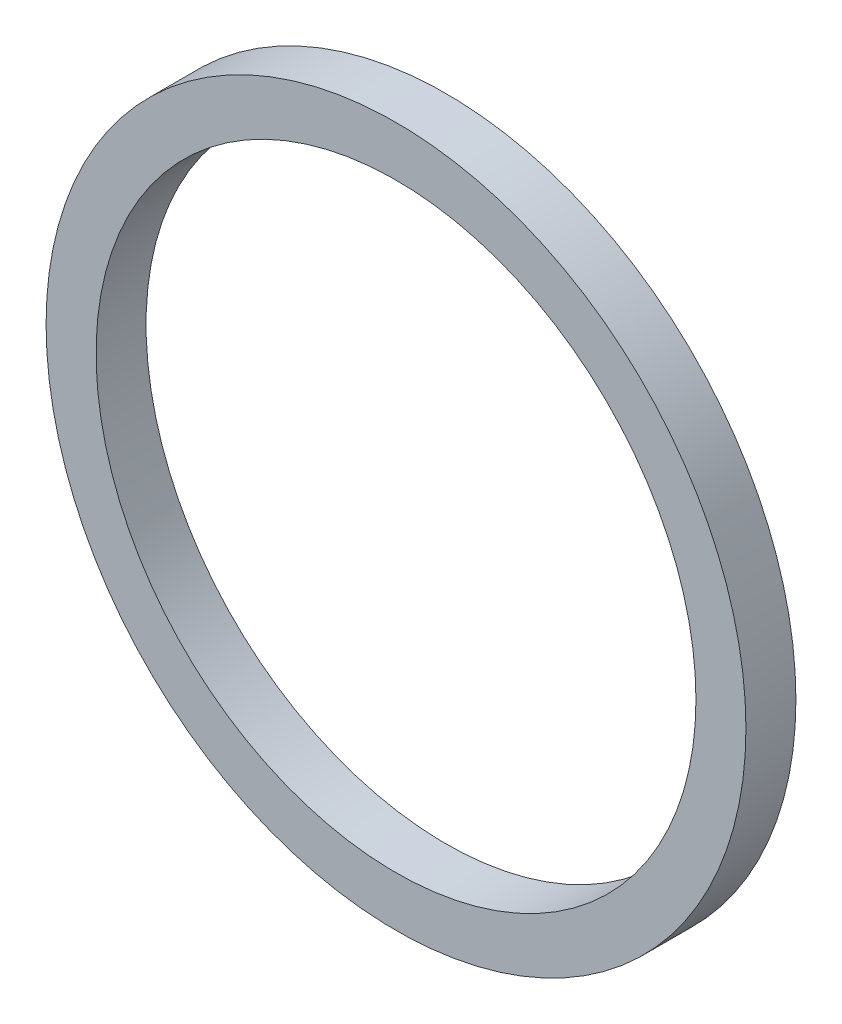
ISO-10303-21;
HEADER;
FILE_DESCRIPTION(('STEP AP214'),'2;1');
FILE_NAME('part.step','',(''),(''),'','','');
FILE_SCHEMA(('AUTOMOTIVE_DESIGN { 1 0 10303 214 1 1 1 1 }'));
ENDSEC;
DATA;
#1=APPLICATION_CONTEXT('core data for automotive mechanical design processes');
#2=APPLICATION_PROTOCOL_DEFINITION('international standard','automotive_design',2000,#1);
#3=PRODUCT_CONTEXT('',#1,'mechanical');
#4=PRODUCT('Part','Part','',(#3));
#5=PRODUCT_RELATED_PRODUCT_CATEGORY('part','',(#4));
#6=PRODUCT_DEFINITION_FORMATION('','',#4);
#7=PRODUCT_DEFINITION_CONTEXT('part definition',#1,'design');
#8=PRODUCT_DEFINITION('design','',#6,#7);
#9=PRODUCT_DEFINITION_SHAPE('','',#8);
#10=(LENGTH_UNIT() NAMED_UNIT(*) SI_UNIT(.MILLI.,.METRE.));
#11=(NAMED_UNIT(*) PLANE_ANGLE_UNIT() SI_UNIT($,.RADIAN.));
#12=(NAMED_UNIT(*) SI_UNIT($,.STERADIAN.) SOLID_ANGLE_UNIT());
#13=UNCERTAINTY_MEASURE_WITH_UNIT(LENGTH_MEASURE(1.E-05),#10,'distance_accuracy_value','');
#14=(GEOMETRIC_REPRESENTATION_CONTEXT(3) GLOBAL_UNCERTAINTY_ASSIGNED_CONTEXT((#13)) GLOBAL_UNIT_ASSIGNED_CONTEXT((#10,
#11,#12)) REPRESENTATION_CONTEXT('',''));
#15=CARTESIAN_POINT('',(0.,0.,0.));
#16=DIRECTION('',(0.,0.,1.));
#17=DIRECTION('',(1.,0.,0.));
#18=AXIS2_PLACEMENT_3D('',#15,#16,#17);
#19=CARTESIAN_POINT('',(0.,0.,1.));
#20=DIRECTION('',(0.,0.,1.));
#21=DIRECTION('',(1.,0.,0.));
#22=AXIS2_PLACEMENT_3D('',#19,#20,#21);
#23=PLANE('',#22);
#24=CARTESIAN_POINT('',(0.,0.,1.));
#25=DIRECTION('',(0.,0.,1.));
#26=DIRECTION('',(1.,0.,0.));
#27=AXIS2_PLACEMENT_3D('',#24,#25,#26);
#28=CIRCLE('',#27,7.);
#29=CARTESIAN_POINT('',(7.,0.,1.));
#30=VERTEX_POINT('',#29);
#31=EDGE_CURVE('E10',#30,#30,#28,.T.);
#32=ORIENTED_EDGE('',*,*,#31,.T.);
#33=EDGE_LOOP('',(#32));
#34=FACE_BOUND('',#33,.T.);
#35=CARTESIAN_POINT('',(0.,0.,1.));
#36=DIRECTION('',(0.,0.,1.));
#37=DIRECTION('',(1.,0.,0.));
#38=AXIS2_PLACEMENT_3D('',#35,#36,#37);
#39=CIRCLE('',#38,6.);
#40=CARTESIAN_POINT('',(6.,0.,1.));
#41=VERTEX_POINT('',#40);
#42=EDGE_CURVE('E46',#41,#41,#39,.T.);
#43=ORIENTED_EDGE('',*,*,#42,.F.);
#44=EDGE_LOOP('',(#43));
#45=FACE_BOUND('',#44,.T.);
#46=ADVANCED_FACE('F35',(#34,#45),#23,.T.);
#47=CARTESIAN_POINT('',(0.,0.,0.));
#48=DIRECTION('',(0.,0.,1.));
#49=DIRECTION('',(1.,0.,0.));
#50=AXIS2_PLACEMENT_3D('',#47,#48,#49);
#51=PLANE('',#50);
#52=CARTESIAN_POINT('',(0.,0.,0.));
#53=DIRECTION('',(0.,0.,1.));
#54=DIRECTION('',(1.,0.,0.));
#55=AXIS2_PLACEMENT_3D('',#52,#53,#54);
#56=CIRCLE('',#55,7.);
#57=CARTESIAN_POINT('',(7.,0.,0.));
#58=VERTEX_POINT('',#57);
#59=EDGE_CURVE('E39',#58,#58,#56,.T.);
#60=ORIENTED_EDGE('',*,*,#59,.F.);
#61=EDGE_LOOP('',(#60));
#62=FACE_BOUND('',#61,.T.);
#63=CARTESIAN_POINT('',(0.,0.,0.));
#64=DIRECTION('',(0.,0.,1.));
#65=DIRECTION('',(1.,0.,0.));
#66=AXIS2_PLACEMENT_3D('',#63,#64,#65);
#67=CIRCLE('',#66,6.);
#68=CARTESIAN_POINT('',(6.,0.,0.));
#69=VERTEX_POINT('',#68);
#70=EDGE_CURVE('E48',#69,#69,#67,.T.);
#71=ORIENTED_EDGE('',*,*,#70,.T.);
#72=EDGE_LOOP('',(#71));
#73=FACE_BOUND('',#72,.T.);
#74=ADVANCED_FACE('F58',(#62,#73),#51,.F.);
#75=CARTESIAN_POINT('',(0.,0.,1.));
#76=DIRECTION('',(0.,0.,-1.));
#77=DIRECTION('',(-1.,0.,0.));
#78=AXIS2_PLACEMENT_3D('',#75,#76,#77);
#79=CYLINDRICAL_SURFACE('',#78,7.);
#80=ORIENTED_EDGE('',*,*,#31,.F.);
#81=EDGE_LOOP('',(#80));
#82=FACE_BOUND('',#81,.T.);
#83=ORIENTED_EDGE('',*,*,#59,.T.);
#84=EDGE_LOOP('',(#83));
#85=FACE_BOUND('',#84,.T.);
#86=ADVANCED_FACE('F37',(#82,#85),#79,.T.);
#87=CARTESIAN_POINT('',(0.,0.,1.));
#88=DIRECTION('',(0.,0.,-1.));
#89=DIRECTION('',(-1.,0.,0.));
#90=AXIS2_PLACEMENT_3D('',#87,#88,#89);
#91=CYLINDRICAL_SURFACE('',#90,6.);
#92=ORIENTED_EDGE('',*,*,#42,.T.);
#93=EDGE_LOOP('',(#92));
#94=FACE_BOUND('',#93,.T.);
#95=ORIENTED_EDGE('',*,*,#70,.F.);
#96=EDGE_LOOP('',(#95));
#97=FACE_BOUND('',#96,.T.);
#98=ADVANCED_FACE('F54',(#94,#97),#91,.F.);
#99=CLOSED_SHELL('',(#46,#74,#86,#98));
#100=MANIFOLD_SOLID_BREP('B2',#99);
#101=ADVANCED_BREP_SHAPE_REPRESENTATION('',(#18,#100),#14);
#102=SHAPE_DEFINITION_REPRESENTATION(#9,#101);
ENDSEC;
END-ISO-10303-21;
